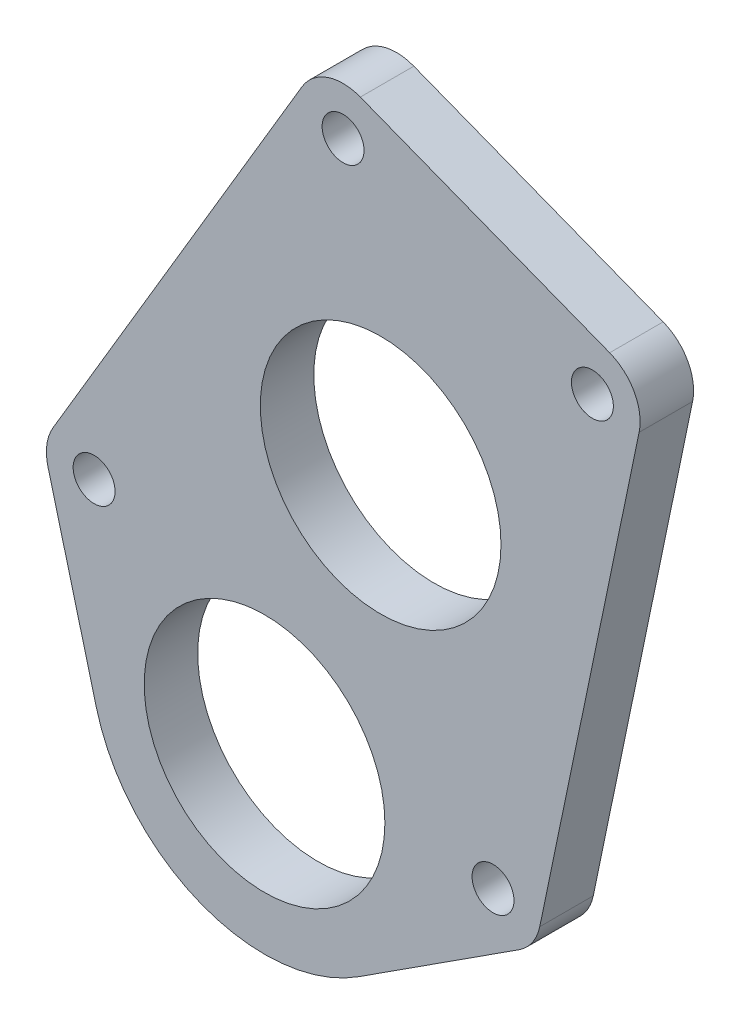
ISO-10303-21;
HEADER;
FILE_DESCRIPTION(('STEP AP214'),'2;1');
FILE_NAME('part.step','',(''),(''),'','','');
FILE_SCHEMA(('AUTOMOTIVE_DESIGN { 1 0 10303 214 1 1 1 1 }'));
ENDSEC;
DATA;
#1=APPLICATION_CONTEXT('core data for automotive mechanical design processes');
#2=APPLICATION_PROTOCOL_DEFINITION('international standard','automotive_design',2000,#1);
#3=PRODUCT_CONTEXT('',#1,'mechanical');
#4=PRODUCT('Part','Part','',(#3));
#5=PRODUCT_RELATED_PRODUCT_CATEGORY('part','',(#4));
#6=PRODUCT_DEFINITION_FORMATION('','',#4);
#7=PRODUCT_DEFINITION_CONTEXT('part definition',#1,'design');
#8=PRODUCT_DEFINITION('design','',#6,#7);
#9=PRODUCT_DEFINITION_SHAPE('','',#8);
#10=(LENGTH_UNIT() NAMED_UNIT(*) SI_UNIT(.MILLI.,.METRE.));
#11=(NAMED_UNIT(*) PLANE_ANGLE_UNIT() SI_UNIT($,.RADIAN.));
#12=(NAMED_UNIT(*) SI_UNIT($,.STERADIAN.) SOLID_ANGLE_UNIT());
#13=UNCERTAINTY_MEASURE_WITH_UNIT(LENGTH_MEASURE(1.E-05),#10,'distance_accuracy_value','');
#14=(GEOMETRIC_REPRESENTATION_CONTEXT(3) GLOBAL_UNCERTAINTY_ASSIGNED_CONTEXT((#13)) GLOBAL_UNIT_ASSIGNED_CONTEXT((#10,
#11,#12)) REPRESENTATION_CONTEXT('',''));
#15=CARTESIAN_POINT('',(0.,0.,0.));
#16=DIRECTION('',(0.,0.,1.));
#17=DIRECTION('',(1.,0.,0.));
#18=AXIS2_PLACEMENT_3D('',#15,#16,#17);
#19=CARTESIAN_POINT('',(-20.2333971621966,18.0691799558478,3.175));
#20=DIRECTION('',(0.,0.,1.));
#21=DIRECTION('',(1.,0.,0.));
#22=AXIS2_PLACEMENT_3D('',#19,#20,#21);
#23=PLANE('',#22);
#24=CARTESIAN_POINT('',(38.9218054409539,56.415107118719,3.175));
#25=DIRECTION('',(0.,0.,1.));
#26=DIRECTION('',(1.,0.,0.));
#27=AXIS2_PLACEMENT_3D('',#24,#25,#26);
#28=CIRCLE('',#27,2.4892);
#29=CARTESIAN_POINT('',(41.4110054409539,56.415107118719,3.175));
#30=VERTEX_POINT('',#29);
#31=EDGE_CURVE('E279',#30,#30,#28,.T.);
#32=ORIENTED_EDGE('',*,*,#31,.F.);
#33=EDGE_LOOP('',(#32));
#34=FACE_BOUND('',#33,.T.);
#35=CARTESIAN_POINT('',(-20.2333971621966,18.0691799558478,3.175));
#36=DIRECTION('',(0.,0.,1.));
#37=DIRECTION('',(1.,0.,0.));
#38=AXIS2_PLACEMENT_3D('',#35,#36,#37);
#39=CIRCLE('',#38,2.4892);
#40=CARTESIAN_POINT('',(-17.7441971621966,18.0691799558478,3.175));
#41=VERTEX_POINT('',#40);
#42=EDGE_CURVE('E263',#41,#41,#39,.T.);
#43=ORIENTED_EDGE('',*,*,#42,.F.);
#44=EDGE_LOOP('',(#43));
#45=FACE_BOUND('',#44,.T.);
#46=CARTESIAN_POINT('',(0.,0.,3.175));
#47=DIRECTION('',(0.,0.,1.));
#48=DIRECTION('',(1.,0.,0.));
#49=AXIS2_PLACEMENT_3D('',#46,#47,#48);
#50=CIRCLE('',#49,14.2875);
#51=CARTESIAN_POINT('',(14.2875,0.,3.175));
#52=VERTEX_POINT('',#51);
#53=EDGE_CURVE('E164',#52,#52,#50,.T.);
#54=ORIENTED_EDGE('',*,*,#53,.F.);
#55=EDGE_LOOP('',(#54));
#56=FACE_BOUND('',#55,.T.);
#57=CARTESIAN_POINT('',(-20.2333971621966,18.0691799558478,3.175));
#58=DIRECTION('',(0.,0.,1.));
#59=DIRECTION('',(1.,0.,0.));
#60=AXIS2_PLACEMENT_3D('',#57,#58,#59);
#61=CIRCLE('',#60,5.6642);
#62=CARTESIAN_POINT('',(-25.1051687767406,20.9586440888185,3.175));
#63=VERTEX_POINT('',#62);
#64=CARTESIAN_POINT('',(-25.7113926159839,16.628788533947,3.175));
#65=VERTEX_POINT('',#64);
#66=EDGE_CURVE('E188',#63,#65,#61,.T.);
#67=ORIENTED_EDGE('',*,*,#66,.T.);
#68=DIRECTION('',(0.254297415681095,-0.967126064366955,0.));
#69=VECTOR('',#68,1.);
#70=CARTESIAN_POINT('',(-25.7113926159839,16.628788533947,3.175));
#71=LINE('',#70,#69);
#72=CARTESIAN_POINT('',(-19.959064153373,-5.24806291611861,3.175));
#73=VERTEX_POINT('',#72);
#74=EDGE_CURVE('E112',#65,#73,#71,.T.);
#75=ORIENTED_EDGE('',*,*,#74,.T.);
#76=CARTESIAN_POINT('',(0.,0.,3.175));
#77=DIRECTION('',(0.,0.,1.));
#78=DIRECTION('',(1.,0.,0.));
#79=AXIS2_PLACEMENT_3D('',#76,#77,#78);
#80=CIRCLE('',#79,20.6375);
#81=CARTESIAN_POINT('',(11.1940448070133,-17.3378132158753,3.175));
#82=VERTEX_POINT('',#81);
#83=EDGE_CURVE('E217',#73,#82,#80,.T.);
#84=ORIENTED_EDGE('',*,*,#83,.T.);
#85=DIRECTION('',(0.84011208798911,0.54241283135134,0.));
#86=VECTOR('',#85,1.);
#87=CARTESIAN_POINT('',(11.1940448070133,-17.3378132158753,3.175));
#88=LINE('',#87,#86);
#89=CARTESIAN_POINT('',(30.1977797155254,-5.06817705024263,3.175));
#90=VERTEX_POINT('',#89);
#91=EDGE_CURVE('E237',#82,#90,#88,.T.);
#92=ORIENTED_EDGE('',*,*,#91,.T.);
#93=CARTESIAN_POINT('',(27.1254449561851,-0.30961416145471,3.175));
#94=DIRECTION('',(0.,0.,1.));
#95=DIRECTION('',(1.,0.,0.));
#96=AXIS2_PLACEMENT_3D('',#93,#94,#95);
#97=CIRCLE('',#96,5.6642);
#98=CARTESIAN_POINT('',(32.6710010671225,-1.46285700684522,3.175));
#99=VERTEX_POINT('',#98);
#100=EDGE_CURVE('E233',#90,#99,#97,.T.);
#101=ORIENTED_EDGE('',*,*,#100,.T.);
#102=DIRECTION('',(0.203602070087656,0.979053725316451,0.));
#103=VECTOR('',#102,1.);
#104=CARTESIAN_POINT('',(32.6710010671225,-1.46285700684521,3.175));
#105=LINE('',#104,#103);
#106=CARTESIAN_POINT('',(44.4673615518914,55.2618642733284,3.175));
#107=VERTEX_POINT('',#106);
#108=EDGE_CURVE('E236',#99,#107,#105,.T.);
#109=ORIENTED_EDGE('',*,*,#108,.T.);
#110=CARTESIAN_POINT('',(38.9218054409539,56.415107118719,3.175));
#111=DIRECTION('',(0.,0.,1.));
#112=DIRECTION('',(1.,0.,0.));
#113=AXIS2_PLACEMENT_3D('',#110,#111,#112);
#114=CIRCLE('',#113,5.66420000000001);
#115=CARTESIAN_POINT('',(40.9710409850331,61.6956180149185,3.175));
#116=VERTEX_POINT('',#115);
#117=EDGE_CURVE('E137',#107,#116,#114,.T.);
#118=ORIENTED_EDGE('',*,*,#117,.T.);
#119=DIRECTION('',(-0.932260671621687,0.361787285773672,0.));
#120=VECTOR('',#119,1.);
#121=CARTESIAN_POINT('',(11.3717646610445,73.1823643382326,3.175));
#122=LINE('',#121,#120);
#123=CARTESIAN_POINT('',(11.3717646610445,73.1823643382326,3.175));
#124=VERTEX_POINT('',#123);
#125=EDGE_CURVE('E131',#116,#124,#122,.T.);
#126=ORIENTED_EDGE('',*,*,#125,.T.);
#127=CARTESIAN_POINT('',(9.3225291169653,67.901853442033,3.175));
#128=DIRECTION('',(0.,0.,1.));
#129=DIRECTION('',(1.,0.,0.));
#130=AXIS2_PLACEMENT_3D('',#127,#128,#129);
#131=CIRCLE('',#130,5.66420000000003);
#132=CARTESIAN_POINT('',(4.45075750242136,70.7913175750038,3.175));
#133=VERTEX_POINT('',#132);
#134=EDGE_CURVE('E135',#124,#133,#131,.T.);
#135=ORIENTED_EDGE('',*,*,#134,.T.);
#136=DIRECTION('',(-0.51012749072609,-0.86009879851416,0.));
#137=VECTOR('',#136,1.);
#138=CARTESIAN_POINT('',(-25.1051687767406,20.9586440888185,3.175));
#139=LINE('',#138,#137);
#140=EDGE_CURVE('E63',#133,#63,#139,.T.);
#141=ORIENTED_EDGE('',*,*,#140,.T.);
#142=EDGE_LOOP('',(#67,#75,#84,#92,#101,#109,#118,#126,#135,#141));
#143=FACE_BOUND('',#142,.T.);
#144=CARTESIAN_POINT('',(13.7840955879769,35.5191315887863,3.175));
#145=DIRECTION('',(0.,0.,1.));
#146=DIRECTION('',(1.,0.,0.));
#147=AXIS2_PLACEMENT_3D('',#144,#145,#146);
#148=CIRCLE('',#147,14.2875);
#149=CARTESIAN_POINT('',(28.0715955879769,35.5191315887863,3.175));
#150=VERTEX_POINT('',#149);
#151=EDGE_CURVE('E255',#150,#150,#148,.T.);
#152=ORIENTED_EDGE('',*,*,#151,.F.);
#153=EDGE_LOOP('',(#152));
#154=FACE_BOUND('',#153,.T.);
#155=CARTESIAN_POINT('',(27.1254449561851,-0.30961416145471,3.175));
#156=DIRECTION('',(0.,0.,1.));
#157=DIRECTION('',(1.,0.,0.));
#158=AXIS2_PLACEMENT_3D('',#155,#156,#157);
#159=CIRCLE('',#158,2.4892);
#160=CARTESIAN_POINT('',(29.6146449561851,-0.30961416145471,3.175));
#161=VERTEX_POINT('',#160);
#162=EDGE_CURVE('E271',#161,#161,#159,.T.);
#163=ORIENTED_EDGE('',*,*,#162,.F.);
#164=EDGE_LOOP('',(#163));
#165=FACE_BOUND('',#164,.T.);
#166=CARTESIAN_POINT('',(9.3225291169653,67.901853442033,3.175));
#167=DIRECTION('',(0.,0.,1.));
#168=DIRECTION('',(1.,0.,0.));
#169=AXIS2_PLACEMENT_3D('',#166,#167,#168);
#170=CIRCLE('',#169,2.48919999999999);
#171=CARTESIAN_POINT('',(11.8117291169653,67.901853442033,3.175));
#172=VERTEX_POINT('',#171);
#173=EDGE_CURVE('E287',#172,#172,#170,.T.);
#174=ORIENTED_EDGE('',*,*,#173,.F.);
#175=EDGE_LOOP('',(#174));
#176=FACE_BOUND('',#175,.T.);
#177=ADVANCED_FACE('F45',(#34,#45,#56,#143,#154,#165,#176),#23,.T.);
#178=CARTESIAN_POINT('',(-20.2333971621966,18.0691799558478,-3.175));
#179=DIRECTION('',(0.,0.,1.));
#180=DIRECTION('',(1.,0.,0.));
#181=AXIS2_PLACEMENT_3D('',#178,#179,#180);
#182=PLANE('',#181);
#183=CARTESIAN_POINT('',(-20.2333971621966,18.0691799558478,-3.175));
#184=DIRECTION('',(0.,0.,1.));
#185=DIRECTION('',(1.,0.,0.));
#186=AXIS2_PLACEMENT_3D('',#183,#184,#185);
#187=CIRCLE('',#186,5.6642);
#188=CARTESIAN_POINT('',(-25.1051687767406,20.9586440888185,-3.175));
#189=VERTEX_POINT('',#188);
#190=CARTESIAN_POINT('',(-25.7113926159839,16.628788533947,-3.175));
#191=VERTEX_POINT('',#190);
#192=EDGE_CURVE('E159',#189,#191,#187,.T.);
#193=ORIENTED_EDGE('',*,*,#192,.F.);
#194=DIRECTION('',(-0.51012749072609,-0.86009879851416,0.));
#195=VECTOR('',#194,1.);
#196=CARTESIAN_POINT('',(-25.1051687767406,20.9586440888185,-3.175));
#197=LINE('',#196,#195);
#198=CARTESIAN_POINT('',(4.45075750242136,70.7913175750038,-3.175));
#199=VERTEX_POINT('',#198);
#200=EDGE_CURVE('E104',#199,#189,#197,.T.);
#201=ORIENTED_EDGE('',*,*,#200,.F.);
#202=CARTESIAN_POINT('',(9.3225291169653,67.901853442033,-3.175));
#203=DIRECTION('',(0.,0.,1.));
#204=DIRECTION('',(1.,0.,0.));
#205=AXIS2_PLACEMENT_3D('',#202,#203,#204);
#206=CIRCLE('',#205,5.66420000000003);
#207=CARTESIAN_POINT('',(11.3717646610445,73.1823643382326,-3.175));
#208=VERTEX_POINT('',#207);
#209=EDGE_CURVE('E98',#208,#199,#206,.T.);
#210=ORIENTED_EDGE('',*,*,#209,.F.);
#211=DIRECTION('',(-0.932260671621687,0.361787285773672,0.));
#212=VECTOR('',#211,1.);
#213=CARTESIAN_POINT('',(11.3717646610445,73.1823643382326,-3.175));
#214=LINE('',#213,#212);
#215=CARTESIAN_POINT('',(40.9710409850331,61.6956180149185,-3.175));
#216=VERTEX_POINT('',#215);
#217=EDGE_CURVE('E146',#216,#208,#214,.T.);
#218=ORIENTED_EDGE('',*,*,#217,.F.);
#219=CARTESIAN_POINT('',(38.9218054409539,56.415107118719,-3.175));
#220=DIRECTION('',(0.,0.,1.));
#221=DIRECTION('',(1.,0.,0.));
#222=AXIS2_PLACEMENT_3D('',#219,#220,#221);
#223=CIRCLE('',#222,5.66420000000001);
#224=CARTESIAN_POINT('',(44.4673615518914,55.2618642733284,-3.175));
#225=VERTEX_POINT('',#224);
#226=EDGE_CURVE('E179',#225,#216,#223,.T.);
#227=ORIENTED_EDGE('',*,*,#226,.F.);
#228=DIRECTION('',(0.203602070087656,0.979053725316451,0.));
#229=VECTOR('',#228,1.);
#230=CARTESIAN_POINT('',(32.6710010671225,-1.46285700684521,-3.175));
#231=LINE('',#230,#229);
#232=CARTESIAN_POINT('',(32.6710010671225,-1.46285700684522,-3.175));
#233=VERTEX_POINT('',#232);
#234=EDGE_CURVE('E176',#233,#225,#231,.T.);
#235=ORIENTED_EDGE('',*,*,#234,.F.);
#236=CARTESIAN_POINT('',(27.1254449561851,-0.30961416145471,-3.175));
#237=DIRECTION('',(0.,0.,1.));
#238=DIRECTION('',(1.,0.,0.));
#239=AXIS2_PLACEMENT_3D('',#236,#237,#238);
#240=CIRCLE('',#239,5.6642);
#241=CARTESIAN_POINT('',(30.1977797155254,-5.06817705024263,-3.175));
#242=VERTEX_POINT('',#241);
#243=EDGE_CURVE('E173',#242,#233,#240,.T.);
#244=ORIENTED_EDGE('',*,*,#243,.F.);
#245=DIRECTION('',(0.84011208798911,0.54241283135134,0.));
#246=VECTOR('',#245,1.);
#247=CARTESIAN_POINT('',(11.1940448070133,-17.3378132158753,-3.175));
#248=LINE('',#247,#246);
#249=CARTESIAN_POINT('',(11.1940448070133,-17.3378132158753,-3.175));
#250=VERTEX_POINT('',#249);
#251=EDGE_CURVE('E170',#250,#242,#248,.T.);
#252=ORIENTED_EDGE('',*,*,#251,.F.);
#253=CARTESIAN_POINT('',(0.,0.,-3.175));
#254=DIRECTION('',(0.,0.,1.));
#255=DIRECTION('',(1.,0.,0.));
#256=AXIS2_PLACEMENT_3D('',#253,#254,#255);
#257=CIRCLE('',#256,20.6375);
#258=CARTESIAN_POINT('',(-19.959064153373,-5.24806291611861,-3.175));
#259=VERTEX_POINT('',#258);
#260=EDGE_CURVE('E167',#259,#250,#257,.T.);
#261=ORIENTED_EDGE('',*,*,#260,.F.);
#262=DIRECTION('',(0.254297415681095,-0.967126064366955,0.));
#263=VECTOR('',#262,1.);
#264=CARTESIAN_POINT('',(-25.7113926159839,16.628788533947,-3.175));
#265=LINE('',#264,#263);
#266=EDGE_CURVE('E163',#191,#259,#265,.T.);
#267=ORIENTED_EDGE('',*,*,#266,.F.);
#268=EDGE_LOOP('',(#193,#201,#210,#218,#227,#235,#244,#252,#261,#267));
#269=FACE_BOUND('',#268,.T.);
#270=CARTESIAN_POINT('',(0.,0.,-3.175));
#271=DIRECTION('',(0.,0.,1.));
#272=DIRECTION('',(1.,0.,0.));
#273=AXIS2_PLACEMENT_3D('',#270,#271,#272);
#274=CIRCLE('',#273,14.2875);
#275=CARTESIAN_POINT('',(14.2875,0.,-3.175));
#276=VERTEX_POINT('',#275);
#277=EDGE_CURVE('E251',#276,#276,#274,.T.);
#278=ORIENTED_EDGE('',*,*,#277,.T.);
#279=EDGE_LOOP('',(#278));
#280=FACE_BOUND('',#279,.T.);
#281=CARTESIAN_POINT('',(13.7840955879769,35.5191315887863,-3.175));
#282=DIRECTION('',(0.,0.,1.));
#283=DIRECTION('',(1.,0.,0.));
#284=AXIS2_PLACEMENT_3D('',#281,#282,#283);
#285=CIRCLE('',#284,14.2875);
#286=CARTESIAN_POINT('',(28.0715955879769,35.5191315887863,-3.175));
#287=VERTEX_POINT('',#286);
#288=EDGE_CURVE('E259',#287,#287,#285,.T.);
#289=ORIENTED_EDGE('',*,*,#288,.T.);
#290=EDGE_LOOP('',(#289));
#291=FACE_BOUND('',#290,.T.);
#292=CARTESIAN_POINT('',(-20.2333971621966,18.0691799558478,-3.175));
#293=DIRECTION('',(0.,0.,1.));
#294=DIRECTION('',(1.,0.,0.));
#295=AXIS2_PLACEMENT_3D('',#292,#293,#294);
#296=CIRCLE('',#295,2.4892);
#297=CARTESIAN_POINT('',(-17.7441971621966,18.0691799558478,-3.175));
#298=VERTEX_POINT('',#297);
#299=EDGE_CURVE('E267',#298,#298,#296,.T.);
#300=ORIENTED_EDGE('',*,*,#299,.T.);
#301=EDGE_LOOP('',(#300));
#302=FACE_BOUND('',#301,.T.);
#303=CARTESIAN_POINT('',(27.1254449561851,-0.30961416145471,-3.175));
#304=DIRECTION('',(0.,0.,1.));
#305=DIRECTION('',(1.,0.,0.));
#306=AXIS2_PLACEMENT_3D('',#303,#304,#305);
#307=CIRCLE('',#306,2.4892);
#308=CARTESIAN_POINT('',(29.6146449561851,-0.30961416145471,-3.175));
#309=VERTEX_POINT('',#308);
#310=EDGE_CURVE('E275',#309,#309,#307,.T.);
#311=ORIENTED_EDGE('',*,*,#310,.T.);
#312=EDGE_LOOP('',(#311));
#313=FACE_BOUND('',#312,.T.);
#314=CARTESIAN_POINT('',(38.9218054409539,56.415107118719,-3.175));
#315=DIRECTION('',(0.,0.,1.));
#316=DIRECTION('',(1.,0.,0.));
#317=AXIS2_PLACEMENT_3D('',#314,#315,#316);
#318=CIRCLE('',#317,2.4892);
#319=CARTESIAN_POINT('',(41.4110054409539,56.415107118719,-3.175));
#320=VERTEX_POINT('',#319);
#321=EDGE_CURVE('E283',#320,#320,#318,.T.);
#322=ORIENTED_EDGE('',*,*,#321,.T.);
#323=EDGE_LOOP('',(#322));
#324=FACE_BOUND('',#323,.T.);
#325=CARTESIAN_POINT('',(9.3225291169653,67.901853442033,-3.175));
#326=DIRECTION('',(0.,0.,1.));
#327=DIRECTION('',(1.,0.,0.));
#328=AXIS2_PLACEMENT_3D('',#325,#326,#327);
#329=CIRCLE('',#328,2.48919999999999);
#330=CARTESIAN_POINT('',(11.8117291169653,67.901853442033,-3.175));
#331=VERTEX_POINT('',#330);
#332=EDGE_CURVE('E291',#331,#331,#329,.T.);
#333=ORIENTED_EDGE('',*,*,#332,.T.);
#334=EDGE_LOOP('',(#333));
#335=FACE_BOUND('',#334,.T.);
#336=ADVANCED_FACE('F221',(#269,#280,#291,#302,#313,#324,#335),#182,.F.);
#337=CARTESIAN_POINT('',(-20.2333971621966,18.0691799558478,3.175));
#338=DIRECTION('',(0.,0.,-1.));
#339=DIRECTION('',(-1.,0.,0.));
#340=AXIS2_PLACEMENT_3D('',#337,#338,#339);
#341=CYLINDRICAL_SURFACE('',#340,5.6642);
#342=ORIENTED_EDGE('',*,*,#192,.T.);
#343=DIRECTION('',(0.,0.,-1.));
#344=VECTOR('',#343,1.);
#345=CARTESIAN_POINT('',(-25.7113926159839,16.628788533947,3.175));
#346=LINE('',#345,#344);
#347=EDGE_CURVE('E11',#65,#191,#346,.T.);
#348=ORIENTED_EDGE('',*,*,#347,.F.);
#349=ORIENTED_EDGE('',*,*,#66,.F.);
#350=DIRECTION('',(0.,0.,-1.));
#351=VECTOR('',#350,1.);
#352=CARTESIAN_POINT('',(-25.1051687767406,20.9586440888185,3.175));
#353=LINE('',#352,#351);
#354=EDGE_CURVE('E155',#63,#189,#353,.T.);
#355=ORIENTED_EDGE('',*,*,#354,.T.);
#356=EDGE_LOOP('',(#342,#348,#349,#355));
#357=FACE_BOUND('',#356,.T.);
#358=ADVANCED_FACE('F47',(#357),#341,.T.);
#359=CARTESIAN_POINT('',(-25.7113926159839,16.628788533947,3.175));
#360=DIRECTION('',(0.967126064366955,0.254297415681096,0.));
#361=DIRECTION('',(-0.254297415681095,0.967126064366955,0.));
#362=AXIS2_PLACEMENT_3D('',#359,#360,#361);
#363=PLANE('',#362);
#364=ORIENTED_EDGE('',*,*,#266,.T.);
#365=DIRECTION('',(0.,0.,-1.));
#366=VECTOR('',#365,1.);
#367=CARTESIAN_POINT('',(-19.959064153373,-5.24806291611861,3.175));
#368=LINE('',#367,#366);
#369=EDGE_CURVE('E55',#73,#259,#368,.T.);
#370=ORIENTED_EDGE('',*,*,#369,.F.);
#371=ORIENTED_EDGE('',*,*,#74,.F.);
#372=ORIENTED_EDGE('',*,*,#347,.T.);
#373=EDGE_LOOP('',(#364,#370,#371,#372));
#374=FACE_BOUND('',#373,.T.);
#375=ADVANCED_FACE('F335',(#374),#363,.F.);
#376=CARTESIAN_POINT('',(0.,0.,3.175));
#377=DIRECTION('',(0.,0.,-1.));
#378=DIRECTION('',(-1.,0.,0.));
#379=AXIS2_PLACEMENT_3D('',#376,#377,#378);
#380=CYLINDRICAL_SURFACE('',#379,20.6375);
#381=ORIENTED_EDGE('',*,*,#260,.T.);
#382=DIRECTION('',(0.,0.,-1.));
#383=VECTOR('',#382,1.);
#384=CARTESIAN_POINT('',(11.1940448070133,-17.3378132158753,3.175));
#385=LINE('',#384,#383);
#386=EDGE_CURVE('E207',#82,#250,#385,.T.);
#387=ORIENTED_EDGE('',*,*,#386,.F.);
#388=ORIENTED_EDGE('',*,*,#83,.F.);
#389=ORIENTED_EDGE('',*,*,#369,.T.);
#390=EDGE_LOOP('',(#381,#387,#388,#389));
#391=FACE_BOUND('',#390,.T.);
#392=ADVANCED_FACE('F215',(#391),#380,.T.);
#393=CARTESIAN_POINT('',(11.1940448070133,-17.3378132158753,3.175));
#394=DIRECTION('',(-0.54241283135134,0.84011208798911,0.));
#395=DIRECTION('',(-0.84011208798911,-0.54241283135134,0.));
#396=AXIS2_PLACEMENT_3D('',#393,#394,#395);
#397=PLANE('',#396);
#398=ORIENTED_EDGE('',*,*,#251,.T.);
#399=DIRECTION('',(0.,0.,-1.));
#400=VECTOR('',#399,1.);
#401=CARTESIAN_POINT('',(30.1977797155254,-5.06817705024263,3.175));
#402=LINE('',#401,#400);
#403=EDGE_CURVE('E203',#90,#242,#402,.T.);
#404=ORIENTED_EDGE('',*,*,#403,.F.);
#405=ORIENTED_EDGE('',*,*,#91,.F.);
#406=ORIENTED_EDGE('',*,*,#386,.T.);
#407=EDGE_LOOP('',(#398,#404,#405,#406));
#408=FACE_BOUND('',#407,.T.);
#409=ADVANCED_FACE('F227',(#408),#397,.F.);
#410=CARTESIAN_POINT('',(27.1254449561851,-0.30961416145471,3.175));
#411=DIRECTION('',(0.,0.,-1.));
#412=DIRECTION('',(-1.,0.,0.));
#413=AXIS2_PLACEMENT_3D('',#410,#411,#412);
#414=CYLINDRICAL_SURFACE('',#413,5.6642);
#415=ORIENTED_EDGE('',*,*,#243,.T.);
#416=DIRECTION('',(0.,0.,-1.));
#417=VECTOR('',#416,1.);
#418=CARTESIAN_POINT('',(32.6710010671225,-1.46285700684522,3.175));
#419=LINE('',#418,#417);
#420=EDGE_CURVE('E199',#99,#233,#419,.T.);
#421=ORIENTED_EDGE('',*,*,#420,.F.);
#422=ORIENTED_EDGE('',*,*,#100,.F.);
#423=ORIENTED_EDGE('',*,*,#403,.T.);
#424=EDGE_LOOP('',(#415,#421,#422,#423));
#425=FACE_BOUND('',#424,.T.);
#426=ADVANCED_FACE('F231',(#425),#414,.T.);
#427=CARTESIAN_POINT('',(32.6710010671225,-1.46285700684521,3.175));
#428=DIRECTION('',(-0.979053725316451,0.203602070087656,0.));
#429=DIRECTION('',(-0.203602070087656,-0.979053725316451,0.));
#430=AXIS2_PLACEMENT_3D('',#427,#428,#429);
#431=PLANE('',#430);
#432=ORIENTED_EDGE('',*,*,#234,.T.);
#433=DIRECTION('',(0.,0.,-1.));
#434=VECTOR('',#433,1.);
#435=CARTESIAN_POINT('',(44.4673615518914,55.2618642733284,3.175));
#436=LINE('',#435,#434);
#437=EDGE_CURVE('E195',#107,#225,#436,.T.);
#438=ORIENTED_EDGE('',*,*,#437,.F.);
#439=ORIENTED_EDGE('',*,*,#108,.F.);
#440=ORIENTED_EDGE('',*,*,#420,.T.);
#441=EDGE_LOOP('',(#432,#438,#439,#440));
#442=FACE_BOUND('',#441,.T.);
#443=ADVANCED_FACE('F325',(#442),#431,.F.);
#444=CARTESIAN_POINT('',(38.9218054409539,56.415107118719,3.175));
#445=DIRECTION('',(0.,0.,-1.));
#446=DIRECTION('',(-1.,0.,0.));
#447=AXIS2_PLACEMENT_3D('',#444,#445,#446);
#448=CYLINDRICAL_SURFACE('',#447,5.66420000000001);
#449=ORIENTED_EDGE('',*,*,#226,.T.);
#450=DIRECTION('',(0.,0.,-1.));
#451=VECTOR('',#450,1.);
#452=CARTESIAN_POINT('',(40.9710409850331,61.6956180149185,3.175));
#453=LINE('',#452,#451);
#454=EDGE_CURVE('E148',#116,#216,#453,.T.);
#455=ORIENTED_EDGE('',*,*,#454,.F.);
#456=ORIENTED_EDGE('',*,*,#117,.F.);
#457=ORIENTED_EDGE('',*,*,#437,.T.);
#458=EDGE_LOOP('',(#449,#455,#456,#457));
#459=FACE_BOUND('',#458,.T.);
#460=ADVANCED_FACE('F322',(#459),#448,.T.);
#461=CARTESIAN_POINT('',(11.3717646610445,73.1823643382326,3.175));
#462=DIRECTION('',(-0.361787285773672,-0.932260671621687,0.));
#463=DIRECTION('',(0.932260671621687,-0.361787285773672,0.));
#464=AXIS2_PLACEMENT_3D('',#461,#462,#463);
#465=PLANE('',#464);
#466=ORIENTED_EDGE('',*,*,#217,.T.);
#467=DIRECTION('',(0.,0.,-1.));
#468=VECTOR('',#467,1.);
#469=CARTESIAN_POINT('',(11.3717646610445,73.1823643382326,3.175));
#470=LINE('',#469,#468);
#471=EDGE_CURVE('E143',#124,#208,#470,.T.);
#472=ORIENTED_EDGE('',*,*,#471,.F.);
#473=ORIENTED_EDGE('',*,*,#125,.F.);
#474=ORIENTED_EDGE('',*,*,#454,.T.);
#475=EDGE_LOOP('',(#466,#472,#473,#474));
#476=FACE_BOUND('',#475,.T.);
#477=ADVANCED_FACE('F144',(#476),#465,.F.);
#478=CARTESIAN_POINT('',(9.3225291169653,67.901853442033,3.175));
#479=DIRECTION('',(0.,0.,-1.));
#480=DIRECTION('',(-1.,0.,0.));
#481=AXIS2_PLACEMENT_3D('',#478,#479,#480);
#482=CYLINDRICAL_SURFACE('',#481,5.66420000000003);
#483=ORIENTED_EDGE('',*,*,#209,.T.);
#484=DIRECTION('',(0.,0.,-1.));
#485=VECTOR('',#484,1.);
#486=CARTESIAN_POINT('',(4.45075750242136,70.7913175750038,3.175));
#487=LINE('',#486,#485);
#488=EDGE_CURVE('E149',#133,#199,#487,.T.);
#489=ORIENTED_EDGE('',*,*,#488,.F.);
#490=ORIENTED_EDGE('',*,*,#134,.F.);
#491=ORIENTED_EDGE('',*,*,#471,.T.);
#492=EDGE_LOOP('',(#483,#489,#490,#491));
#493=FACE_BOUND('',#492,.T.);
#494=ADVANCED_FACE('F151',(#493),#482,.T.);
#495=CARTESIAN_POINT('',(-25.1051687767406,20.9586440888185,3.175));
#496=DIRECTION('',(0.86009879851416,-0.51012749072609,0.));
#497=DIRECTION('',(0.51012749072609,0.86009879851416,0.));
#498=AXIS2_PLACEMENT_3D('',#495,#496,#497);
#499=PLANE('',#498);
#500=ORIENTED_EDGE('',*,*,#200,.T.);
#501=ORIENTED_EDGE('',*,*,#354,.F.);
#502=ORIENTED_EDGE('',*,*,#140,.F.);
#503=ORIENTED_EDGE('',*,*,#488,.T.);
#504=EDGE_LOOP('',(#500,#501,#502,#503));
#505=FACE_BOUND('',#504,.T.);
#506=ADVANCED_FACE('F315',(#505),#499,.F.);
#507=CARTESIAN_POINT('',(0.,0.,3.175));
#508=DIRECTION('',(0.,0.,-1.));
#509=DIRECTION('',(-1.,0.,0.));
#510=AXIS2_PLACEMENT_3D('',#507,#508,#509);
#511=CYLINDRICAL_SURFACE('',#510,14.2875);
#512=ORIENTED_EDGE('',*,*,#53,.T.);
#513=EDGE_LOOP('',(#512));
#514=FACE_BOUND('',#513,.T.);
#515=ORIENTED_EDGE('',*,*,#277,.F.);
#516=EDGE_LOOP('',(#515));
#517=FACE_BOUND('',#516,.T.);
#518=ADVANCED_FACE('F312',(#514,#517),#511,.F.);
#519=CARTESIAN_POINT('',(13.7840955879769,35.5191315887863,3.175));
#520=DIRECTION('',(0.,0.,-1.));
#521=DIRECTION('',(-1.,0.,0.));
#522=AXIS2_PLACEMENT_3D('',#519,#520,#521);
#523=CYLINDRICAL_SURFACE('',#522,14.2875);
#524=ORIENTED_EDGE('',*,*,#151,.T.);
#525=EDGE_LOOP('',(#524));
#526=FACE_BOUND('',#525,.T.);
#527=ORIENTED_EDGE('',*,*,#288,.F.);
#528=EDGE_LOOP('',(#527));
#529=FACE_BOUND('',#528,.T.);
#530=ADVANCED_FACE('F410',(#526,#529),#523,.F.);
#531=CARTESIAN_POINT('',(-20.2333971621966,18.0691799558478,3.175));
#532=DIRECTION('',(0.,0.,-1.));
#533=DIRECTION('',(-1.,0.,0.));
#534=AXIS2_PLACEMENT_3D('',#531,#532,#533);
#535=CYLINDRICAL_SURFACE('',#534,2.4892);
#536=ORIENTED_EDGE('',*,*,#42,.T.);
#537=EDGE_LOOP('',(#536));
#538=FACE_BOUND('',#537,.T.);
#539=ORIENTED_EDGE('',*,*,#299,.F.);
#540=EDGE_LOOP('',(#539));
#541=FACE_BOUND('',#540,.T.);
#542=ADVANCED_FACE('F418',(#538,#541),#535,.F.);
#543=CARTESIAN_POINT('',(27.1254449561851,-0.30961416145471,3.175));
#544=DIRECTION('',(0.,0.,-1.));
#545=DIRECTION('',(-1.,0.,0.));
#546=AXIS2_PLACEMENT_3D('',#543,#544,#545);
#547=CYLINDRICAL_SURFACE('',#546,2.4892);
#548=ORIENTED_EDGE('',*,*,#162,.T.);
#549=EDGE_LOOP('',(#548));
#550=FACE_BOUND('',#549,.T.);
#551=ORIENTED_EDGE('',*,*,#310,.F.);
#552=EDGE_LOOP('',(#551));
#553=FACE_BOUND('',#552,.T.);
#554=ADVANCED_FACE('F426',(#550,#553),#547,.F.);
#555=CARTESIAN_POINT('',(38.9218054409539,56.415107118719,3.175));
#556=DIRECTION('',(0.,0.,-1.));
#557=DIRECTION('',(-1.,0.,0.));
#558=AXIS2_PLACEMENT_3D('',#555,#556,#557);
#559=CYLINDRICAL_SURFACE('',#558,2.4892);
#560=ORIENTED_EDGE('',*,*,#31,.T.);
#561=EDGE_LOOP('',(#560));
#562=FACE_BOUND('',#561,.T.);
#563=ORIENTED_EDGE('',*,*,#321,.F.);
#564=EDGE_LOOP('',(#563));
#565=FACE_BOUND('',#564,.T.);
#566=ADVANCED_FACE('F435',(#562,#565),#559,.F.);
#567=CARTESIAN_POINT('',(9.3225291169653,67.901853442033,3.175));
#568=DIRECTION('',(0.,0.,-1.));
#569=DIRECTION('',(-1.,0.,0.));
#570=AXIS2_PLACEMENT_3D('',#567,#568,#569);
#571=CYLINDRICAL_SURFACE('',#570,2.48919999999999);
#572=ORIENTED_EDGE('',*,*,#173,.T.);
#573=EDGE_LOOP('',(#572));
#574=FACE_BOUND('',#573,.T.);
#575=ORIENTED_EDGE('',*,*,#332,.F.);
#576=EDGE_LOOP('',(#575));
#577=FACE_BOUND('',#576,.T.);
#578=ADVANCED_FACE('F299',(#574,#577),#571,.F.);
#579=CLOSED_SHELL('',(#177,#336,#358,#375,#392,#409,#426,#443,#460,#477,#494,#506,#518,#530,
#542,#554,#566,#578));
#580=MANIFOLD_SOLID_BREP('B2',#579);
#581=ADVANCED_BREP_SHAPE_REPRESENTATION('',(#18,#580),#14);
#582=SHAPE_DEFINITION_REPRESENTATION(#9,#581);
ENDSEC;
END-ISO-10303-21;
